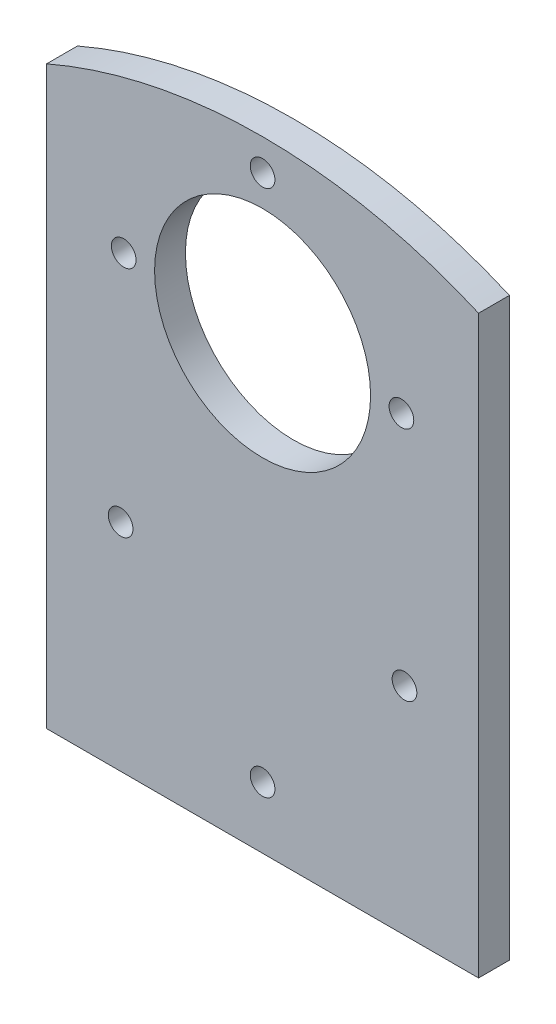
ISO-10303-21;
HEADER;
FILE_DESCRIPTION(('STEP AP214'),'2;1');
FILE_NAME('part.step','',(''),(''),'','','');
FILE_SCHEMA(('AUTOMOTIVE_DESIGN { 1 0 10303 214 1 1 1 1 }'));
ENDSEC;
DATA;
#1=APPLICATION_CONTEXT('core data for automotive mechanical design processes');
#2=APPLICATION_PROTOCOL_DEFINITION('international standard','automotive_design',2000,#1);
#3=PRODUCT_CONTEXT('',#1,'mechanical');
#4=PRODUCT('Part','Part','',(#3));
#5=PRODUCT_RELATED_PRODUCT_CATEGORY('part','',(#4));
#6=PRODUCT_DEFINITION_FORMATION('','',#4);
#7=PRODUCT_DEFINITION_CONTEXT('part definition',#1,'design');
#8=PRODUCT_DEFINITION('design','',#6,#7);
#9=PRODUCT_DEFINITION_SHAPE('','',#8);
#10=(LENGTH_UNIT() NAMED_UNIT(*) SI_UNIT(.MILLI.,.METRE.));
#11=(NAMED_UNIT(*) PLANE_ANGLE_UNIT() SI_UNIT($,.RADIAN.));
#12=(NAMED_UNIT(*) SI_UNIT($,.STERADIAN.) SOLID_ANGLE_UNIT());
#13=UNCERTAINTY_MEASURE_WITH_UNIT(LENGTH_MEASURE(1.E-05),#10,'distance_accuracy_value','');
#14=(GEOMETRIC_REPRESENTATION_CONTEXT(3) GLOBAL_UNCERTAINTY_ASSIGNED_CONTEXT((#13)) GLOBAL_UNIT_ASSIGNED_CONTEXT((#10,
#11,#12)) REPRESENTATION_CONTEXT('',''));
#15=CARTESIAN_POINT('',(0.,0.,0.));
#16=DIRECTION('',(0.,0.,1.));
#17=DIRECTION('',(1.,0.,0.));
#18=AXIS2_PLACEMENT_3D('',#15,#16,#17);
#19=CARTESIAN_POINT('',(-35.,-52.5,5.));
#20=DIRECTION('',(1.,0.,0.));
#21=DIRECTION('',(0.,0.,-1.));
#22=AXIS2_PLACEMENT_3D('',#19,#20,#21);
#23=PLANE('',#22);
#24=DIRECTION('',(0.,-1.,0.));
#25=VECTOR('',#24,1.);
#26=CARTESIAN_POINT('',(-35.,-52.5,5.));
#27=LINE('',#26,#25);
#28=CARTESIAN_POINT('',(-35.,40.7935435021813,5.));
#29=VERTEX_POINT('',#28);
#30=CARTESIAN_POINT('',(-35.,-52.5,5.));
#31=VERTEX_POINT('',#30);
#32=EDGE_CURVE('E88',#29,#31,#27,.T.);
#33=ORIENTED_EDGE('',*,*,#32,.F.);
#34=DIRECTION('',(0.,0.,1.));
#35=VECTOR('',#34,1.);
#36=CARTESIAN_POINT('',(-35.,40.7935435021813,-5.));
#37=LINE('',#36,#35);
#38=CARTESIAN_POINT('',(-35.,40.7935435021813,0.));
#39=VERTEX_POINT('',#38);
#40=EDGE_CURVE('E124',#39,#29,#37,.T.);
#41=ORIENTED_EDGE('',*,*,#40,.F.);
#42=DIRECTION('',(0.,-1.,0.));
#43=VECTOR('',#42,1.);
#44=CARTESIAN_POINT('',(-35.,-52.5,0.));
#45=LINE('',#44,#43);
#46=CARTESIAN_POINT('',(-35.,-52.5,0.));
#47=VERTEX_POINT('',#46);
#48=EDGE_CURVE('E80',#39,#47,#45,.T.);
#49=ORIENTED_EDGE('',*,*,#48,.T.);
#50=DIRECTION('',(0.,0.,-1.));
#51=VECTOR('',#50,1.);
#52=CARTESIAN_POINT('',(-35.,-52.5,5.));
#53=LINE('',#52,#51);
#54=EDGE_CURVE('E42',#31,#47,#53,.T.);
#55=ORIENTED_EDGE('',*,*,#54,.F.);
#56=EDGE_LOOP('',(#33,#41,#49,#55));
#57=FACE_BOUND('',#56,.T.);
#58=ADVANCED_FACE('F35',(#57),#23,.F.);
#59=CARTESIAN_POINT('',(35.,-52.5,5.));
#60=DIRECTION('',(0.,1.,0.));
#61=DIRECTION('',(-1.,0.,0.));
#62=AXIS2_PLACEMENT_3D('',#59,#60,#61);
#63=PLANE('',#62);
#64=DIRECTION('',(1.,0.,0.));
#65=VECTOR('',#64,1.);
#66=CARTESIAN_POINT('',(35.,-52.5,0.));
#67=LINE('',#66,#65);
#68=CARTESIAN_POINT('',(35.,-52.5,0.));
#69=VERTEX_POINT('',#68);
#70=EDGE_CURVE('E70',#47,#69,#67,.T.);
#71=ORIENTED_EDGE('',*,*,#70,.T.);
#72=DIRECTION('',(0.,0.,-1.));
#73=VECTOR('',#72,1.);
#74=CARTESIAN_POINT('',(35.,-52.5,5.));
#75=LINE('',#74,#73);
#76=CARTESIAN_POINT('',(35.,-52.5,5.));
#77=VERTEX_POINT('',#76);
#78=EDGE_CURVE('E73',#77,#69,#75,.T.);
#79=ORIENTED_EDGE('',*,*,#78,.F.);
#80=DIRECTION('',(1.,0.,0.));
#81=VECTOR('',#80,1.);
#82=CARTESIAN_POINT('',(35.,-52.5,5.));
#83=LINE('',#82,#81);
#84=EDGE_CURVE('E57',#31,#77,#83,.T.);
#85=ORIENTED_EDGE('',*,*,#84,.F.);
#86=ORIENTED_EDGE('',*,*,#54,.T.);
#87=EDGE_LOOP('',(#71,#79,#85,#86));
#88=FACE_BOUND('',#87,.T.);
#89=ADVANCED_FACE('F72',(#88),#63,.F.);
#90=CARTESIAN_POINT('',(35.,-52.5,5.));
#91=DIRECTION('',(-1.,0.,0.));
#92=DIRECTION('',(0.,0.,1.));
#93=AXIS2_PLACEMENT_3D('',#90,#91,#92);
#94=PLANE('',#93);
#95=DIRECTION('',(0.,1.,0.));
#96=VECTOR('',#95,1.);
#97=CARTESIAN_POINT('',(35.,-52.5,0.));
#98=LINE('',#97,#96);
#99=CARTESIAN_POINT('',(35.,40.7935435021813,0.));
#100=VERTEX_POINT('',#99);
#101=EDGE_CURVE('E79',#69,#100,#98,.T.);
#102=ORIENTED_EDGE('',*,*,#101,.T.);
#103=DIRECTION('',(0.,0.,1.));
#104=VECTOR('',#103,1.);
#105=CARTESIAN_POINT('',(35.,40.7935435021813,-5.));
#106=LINE('',#105,#104);
#107=CARTESIAN_POINT('',(35.,40.7935435021813,5.));
#108=VERTEX_POINT('',#107);
#109=EDGE_CURVE('E49',#100,#108,#106,.T.);
#110=ORIENTED_EDGE('',*,*,#109,.T.);
#111=DIRECTION('',(0.,1.,0.));
#112=VECTOR('',#111,1.);
#113=CARTESIAN_POINT('',(35.,-52.5,5.));
#114=LINE('',#113,#112);
#115=EDGE_CURVE('E85',#77,#108,#114,.T.);
#116=ORIENTED_EDGE('',*,*,#115,.F.);
#117=ORIENTED_EDGE('',*,*,#78,.T.);
#118=EDGE_LOOP('',(#102,#110,#116,#117));
#119=FACE_BOUND('',#118,.T.);
#120=ADVANCED_FACE('F84',(#119),#94,.F.);
#121=CARTESIAN_POINT('',(0.,0.,5.));
#122=DIRECTION('',(0.,0.,1.));
#123=DIRECTION('',(1.,0.,0.));
#124=AXIS2_PLACEMENT_3D('',#121,#122,#123);
#125=PLANE('',#124);
#126=CARTESIAN_POINT('',(0.,-39.6661412899121,5.));
#127=DIRECTION('',(0.,0.,-1.));
#128=DIRECTION('',(-1.,0.,0.));
#129=AXIS2_PLACEMENT_3D('',#126,#127,#128);
#130=CIRCLE('',#129,87.7425830303795);
#131=EDGE_CURVE('E139',#29,#108,#130,.T.);
#132=ORIENTED_EDGE('',*,*,#131,.F.);
#133=ORIENTED_EDGE('',*,*,#32,.T.);
#134=ORIENTED_EDGE('',*,*,#84,.T.);
#135=ORIENTED_EDGE('',*,*,#115,.T.);
#136=EDGE_LOOP('',(#132,#133,#134,#135));
#137=FACE_BOUND('',#136,.T.);
#138=CARTESIAN_POINT('',(0.,-42.5,5.));
#139=DIRECTION('',(0.,0.,1.));
#140=DIRECTION('',(1.,0.,0.));
#141=AXIS2_PLACEMENT_3D('',#138,#139,#140);
#142=CIRCLE('',#141,2.);
#143=CARTESIAN_POINT('',(2.00000000000002,-42.5,5.));
#144=VERTEX_POINT('',#143);
#145=EDGE_CURVE('E133',#144,#144,#142,.T.);
#146=ORIENTED_EDGE('',*,*,#145,.F.);
#147=EDGE_LOOP('',(#146));
#148=FACE_BOUND('',#147,.T.);
#149=CARTESIAN_POINT('',(-23.,-17.5,5.));
#150=DIRECTION('',(0.,0.,1.));
#151=DIRECTION('',(1.,0.,0.));
#152=AXIS2_PLACEMENT_3D('',#149,#150,#151);
#153=CIRCLE('',#152,2.00000000000001);
#154=CARTESIAN_POINT('',(-21.,-17.5,5.));
#155=VERTEX_POINT('',#154);
#156=EDGE_CURVE('E127',#155,#155,#153,.T.);
#157=ORIENTED_EDGE('',*,*,#156,.F.);
#158=EDGE_LOOP('',(#157));
#159=FACE_BOUND('',#158,.T.);
#160=CARTESIAN_POINT('',(23.,-17.5,5.));
#161=DIRECTION('',(0.,0.,1.));
#162=DIRECTION('',(-1.,0.,0.));
#163=AXIS2_PLACEMENT_3D('',#160,#161,#162);
#164=CIRCLE('',#163,2.00000000000001);
#165=CARTESIAN_POINT('',(21.,-17.5,5.));
#166=VERTEX_POINT('',#165);
#167=EDGE_CURVE('E120',#166,#166,#164,.T.);
#168=ORIENTED_EDGE('',*,*,#167,.F.);
#169=EDGE_LOOP('',(#168));
#170=FACE_BOUND('',#169,.T.);
#171=CARTESIAN_POINT('',(0.,43.,5.));
#172=DIRECTION('',(0.,0.,1.));
#173=DIRECTION('',(1.,0.,0.));
#174=AXIS2_PLACEMENT_3D('',#171,#172,#173);
#175=CIRCLE('',#174,2.);
#176=CARTESIAN_POINT('',(2.,43.,5.));
#177=VERTEX_POINT('',#176);
#178=EDGE_CURVE('E115',#177,#177,#175,.T.);
#179=ORIENTED_EDGE('',*,*,#178,.F.);
#180=EDGE_LOOP('',(#179));
#181=FACE_BOUND('',#180,.T.);
#182=CARTESIAN_POINT('',(-22.5,20.5,5.));
#183=DIRECTION('',(0.,0.,1.));
#184=DIRECTION('',(1.,0.,0.));
#185=AXIS2_PLACEMENT_3D('',#182,#183,#184);
#186=CIRCLE('',#185,2.);
#187=CARTESIAN_POINT('',(-20.5,20.5,5.));
#188=VERTEX_POINT('',#187);
#189=EDGE_CURVE('E112',#188,#188,#186,.T.);
#190=ORIENTED_EDGE('',*,*,#189,.F.);
#191=EDGE_LOOP('',(#190));
#192=FACE_BOUND('',#191,.T.);
#193=CARTESIAN_POINT('',(22.5,20.5,5.));
#194=DIRECTION('',(0.,0.,1.));
#195=DIRECTION('',(1.,0.,0.));
#196=AXIS2_PLACEMENT_3D('',#193,#194,#195);
#197=CIRCLE('',#196,2.);
#198=CARTESIAN_POINT('',(24.5,20.5,5.));
#199=VERTEX_POINT('',#198);
#200=EDGE_CURVE('E105',#199,#199,#197,.T.);
#201=ORIENTED_EDGE('',*,*,#200,.F.);
#202=EDGE_LOOP('',(#201));
#203=FACE_BOUND('',#202,.T.);
#204=CARTESIAN_POINT('',(0.,20.5,5.));
#205=DIRECTION('',(0.,0.,-1.));
#206=DIRECTION('',(-1.,0.,0.));
#207=AXIS2_PLACEMENT_3D('',#204,#205,#206);
#208=CIRCLE('',#207,17.5);
#209=CARTESIAN_POINT('',(-17.5,20.5,5.));
#210=VERTEX_POINT('',#209);
#211=EDGE_CURVE('E93',#210,#210,#208,.T.);
#212=ORIENTED_EDGE('',*,*,#211,.T.);
#213=EDGE_LOOP('',(#212));
#214=FACE_BOUND('',#213,.T.);
#215=ADVANCED_FACE('F149',(#137,#148,#159,#170,#181,#192,#203,#214),#125,.T.);
#216=CARTESIAN_POINT('',(0.,0.,0.));
#217=DIRECTION('',(0.,0.,1.));
#218=DIRECTION('',(1.,0.,0.));
#219=AXIS2_PLACEMENT_3D('',#216,#217,#218);
#220=PLANE('',#219);
#221=CARTESIAN_POINT('',(0.,-42.5,0.));
#222=DIRECTION('',(0.,0.,1.));
#223=DIRECTION('',(1.,0.,0.));
#224=AXIS2_PLACEMENT_3D('',#221,#222,#223);
#225=CIRCLE('',#224,2.);
#226=CARTESIAN_POINT('',(2.00000000000002,-42.5,0.));
#227=VERTEX_POINT('',#226);
#228=EDGE_CURVE('E106',#227,#227,#225,.T.);
#229=ORIENTED_EDGE('',*,*,#228,.T.);
#230=EDGE_LOOP('',(#229));
#231=FACE_BOUND('',#230,.T.);
#232=CARTESIAN_POINT('',(-23.,-17.5,0.));
#233=DIRECTION('',(0.,0.,1.));
#234=DIRECTION('',(1.,0.,0.));
#235=AXIS2_PLACEMENT_3D('',#232,#233,#234);
#236=CIRCLE('',#235,2.00000000000001);
#237=CARTESIAN_POINT('',(-21.,-17.5,0.));
#238=VERTEX_POINT('',#237);
#239=EDGE_CURVE('E130',#238,#238,#236,.T.);
#240=ORIENTED_EDGE('',*,*,#239,.T.);
#241=EDGE_LOOP('',(#240));
#242=FACE_BOUND('',#241,.T.);
#243=CARTESIAN_POINT('',(23.,-17.5,0.));
#244=DIRECTION('',(0.,0.,1.));
#245=DIRECTION('',(-1.,0.,0.));
#246=AXIS2_PLACEMENT_3D('',#243,#244,#245);
#247=CIRCLE('',#246,2.00000000000001);
#248=CARTESIAN_POINT('',(21.,-17.5,0.));
#249=VERTEX_POINT('',#248);
#250=EDGE_CURVE('E123',#249,#249,#247,.T.);
#251=ORIENTED_EDGE('',*,*,#250,.T.);
#252=EDGE_LOOP('',(#251));
#253=FACE_BOUND('',#252,.T.);
#254=CARTESIAN_POINT('',(0.,43.,0.));
#255=DIRECTION('',(0.,0.,1.));
#256=DIRECTION('',(1.,0.,0.));
#257=AXIS2_PLACEMENT_3D('',#254,#255,#256);
#258=CIRCLE('',#257,2.);
#259=CARTESIAN_POINT('',(2.,43.,0.));
#260=VERTEX_POINT('',#259);
#261=EDGE_CURVE('E99',#260,#260,#258,.T.);
#262=ORIENTED_EDGE('',*,*,#261,.T.);
#263=EDGE_LOOP('',(#262));
#264=FACE_BOUND('',#263,.T.);
#265=CARTESIAN_POINT('',(-22.5,20.5,0.));
#266=DIRECTION('',(0.,0.,1.));
#267=DIRECTION('',(1.,0.,0.));
#268=AXIS2_PLACEMENT_3D('',#265,#266,#267);
#269=CIRCLE('',#268,2.);
#270=CARTESIAN_POINT('',(-20.5,20.5,0.));
#271=VERTEX_POINT('',#270);
#272=EDGE_CURVE('E109',#271,#271,#269,.T.);
#273=ORIENTED_EDGE('',*,*,#272,.T.);
#274=EDGE_LOOP('',(#273));
#275=FACE_BOUND('',#274,.T.);
#276=CARTESIAN_POINT('',(22.5,20.5,0.));
#277=DIRECTION('',(0.,0.,1.));
#278=DIRECTION('',(1.,0.,0.));
#279=AXIS2_PLACEMENT_3D('',#276,#277,#278);
#280=CIRCLE('',#279,2.);
#281=CARTESIAN_POINT('',(24.5,20.5,0.));
#282=VERTEX_POINT('',#281);
#283=EDGE_CURVE('E102',#282,#282,#280,.T.);
#284=ORIENTED_EDGE('',*,*,#283,.T.);
#285=EDGE_LOOP('',(#284));
#286=FACE_BOUND('',#285,.T.);
#287=CARTESIAN_POINT('',(0.,20.5,0.));
#288=DIRECTION('',(0.,0.,-1.));
#289=DIRECTION('',(-1.,0.,0.));
#290=AXIS2_PLACEMENT_3D('',#287,#288,#289);
#291=CIRCLE('',#290,17.5);
#292=CARTESIAN_POINT('',(-17.5,20.5,0.));
#293=VERTEX_POINT('',#292);
#294=EDGE_CURVE('E96',#293,#293,#291,.T.);
#295=ORIENTED_EDGE('',*,*,#294,.F.);
#296=EDGE_LOOP('',(#295));
#297=FACE_BOUND('',#296,.T.);
#298=ORIENTED_EDGE('',*,*,#48,.F.);
#299=CARTESIAN_POINT('',(0.,-39.6661412899121,0.));
#300=DIRECTION('',(0.,0.,1.));
#301=DIRECTION('',(1.,0.,0.));
#302=AXIS2_PLACEMENT_3D('',#299,#300,#301);
#303=CIRCLE('',#302,87.7425830303795);
#304=EDGE_CURVE('E11',#39,#100,#303,.F.);
#305=ORIENTED_EDGE('',*,*,#304,.T.);
#306=ORIENTED_EDGE('',*,*,#101,.F.);
#307=ORIENTED_EDGE('',*,*,#70,.F.);
#308=EDGE_LOOP('',(#298,#305,#306,#307));
#309=FACE_BOUND('',#308,.T.);
#310=ADVANCED_FACE('F87',(#231,#242,#253,#264,#275,#286,#297,#309),#220,.F.);
#311=CARTESIAN_POINT('',(0.,20.5,5.));
#312=DIRECTION('',(0.,0.,-1.));
#313=DIRECTION('',(-1.,0.,0.));
#314=AXIS2_PLACEMENT_3D('',#311,#312,#313);
#315=CYLINDRICAL_SURFACE('',#314,17.5);
#316=ORIENTED_EDGE('',*,*,#211,.F.);
#317=EDGE_LOOP('',(#316));
#318=FACE_BOUND('',#317,.T.);
#319=ORIENTED_EDGE('',*,*,#294,.T.);
#320=EDGE_LOOP('',(#319));
#321=FACE_BOUND('',#320,.T.);
#322=ADVANCED_FACE('F167',(#318,#321),#315,.F.);
#323=CARTESIAN_POINT('',(22.5,20.5,0.));
#324=DIRECTION('',(0.,0.,1.));
#325=DIRECTION('',(1.,0.,0.));
#326=AXIS2_PLACEMENT_3D('',#323,#324,#325);
#327=CYLINDRICAL_SURFACE('',#326,2.);
#328=ORIENTED_EDGE('',*,*,#283,.F.);
#329=EDGE_LOOP('',(#328));
#330=FACE_BOUND('',#329,.T.);
#331=ORIENTED_EDGE('',*,*,#200,.T.);
#332=EDGE_LOOP('',(#331));
#333=FACE_BOUND('',#332,.T.);
#334=ADVANCED_FACE('F170',(#330,#333),#327,.F.);
#335=CARTESIAN_POINT('',(-22.5,20.5,0.));
#336=DIRECTION('',(0.,0.,1.));
#337=DIRECTION('',(1.,0.,0.));
#338=AXIS2_PLACEMENT_3D('',#335,#336,#337);
#339=CYLINDRICAL_SURFACE('',#338,2.);
#340=ORIENTED_EDGE('',*,*,#272,.F.);
#341=EDGE_LOOP('',(#340));
#342=FACE_BOUND('',#341,.T.);
#343=ORIENTED_EDGE('',*,*,#189,.T.);
#344=EDGE_LOOP('',(#343));
#345=FACE_BOUND('',#344,.T.);
#346=ADVANCED_FACE('F242',(#342,#345),#339,.F.);
#347=CARTESIAN_POINT('',(0.,43.,0.));
#348=DIRECTION('',(0.,0.,1.));
#349=DIRECTION('',(1.,0.,0.));
#350=AXIS2_PLACEMENT_3D('',#347,#348,#349);
#351=CYLINDRICAL_SURFACE('',#350,2.);
#352=ORIENTED_EDGE('',*,*,#261,.F.);
#353=EDGE_LOOP('',(#352));
#354=FACE_BOUND('',#353,.T.);
#355=ORIENTED_EDGE('',*,*,#178,.T.);
#356=EDGE_LOOP('',(#355));
#357=FACE_BOUND('',#356,.T.);
#358=ADVANCED_FACE('F234',(#354,#357),#351,.F.);
#359=CARTESIAN_POINT('',(23.,-17.5,0.));
#360=DIRECTION('',(0.,0.,1.));
#361=DIRECTION('',(1.,0.,0.));
#362=AXIS2_PLACEMENT_3D('',#359,#360,#361);
#363=CYLINDRICAL_SURFACE('',#362,2.00000000000001);
#364=ORIENTED_EDGE('',*,*,#250,.F.);
#365=EDGE_LOOP('',(#364));
#366=FACE_BOUND('',#365,.T.);
#367=ORIENTED_EDGE('',*,*,#167,.T.);
#368=EDGE_LOOP('',(#367));
#369=FACE_BOUND('',#368,.T.);
#370=ADVANCED_FACE('F226',(#366,#369),#363,.F.);
#371=CARTESIAN_POINT('',(-23.,-17.5,0.));
#372=DIRECTION('',(0.,0.,1.));
#373=DIRECTION('',(1.,0.,0.));
#374=AXIS2_PLACEMENT_3D('',#371,#372,#373);
#375=CYLINDRICAL_SURFACE('',#374,2.00000000000001);
#376=ORIENTED_EDGE('',*,*,#239,.F.);
#377=EDGE_LOOP('',(#376));
#378=FACE_BOUND('',#377,.T.);
#379=ORIENTED_EDGE('',*,*,#156,.T.);
#380=EDGE_LOOP('',(#379));
#381=FACE_BOUND('',#380,.T.);
#382=ADVANCED_FACE('F219',(#378,#381),#375,.F.);
#383=CARTESIAN_POINT('',(0.,-42.5,0.));
#384=DIRECTION('',(0.,0.,1.));
#385=DIRECTION('',(1.,0.,0.));
#386=AXIS2_PLACEMENT_3D('',#383,#384,#385);
#387=CYLINDRICAL_SURFACE('',#386,2.);
#388=ORIENTED_EDGE('',*,*,#228,.F.);
#389=EDGE_LOOP('',(#388));
#390=FACE_BOUND('',#389,.T.);
#391=ORIENTED_EDGE('',*,*,#145,.T.);
#392=EDGE_LOOP('',(#391));
#393=FACE_BOUND('',#392,.T.);
#394=ADVANCED_FACE('F209',(#390,#393),#387,.F.);
#395=CARTESIAN_POINT('',(0.,-39.6661412899121,-5.));
#396=DIRECTION('',(0.,0.,1.));
#397=DIRECTION('',(1.,0.,0.));
#398=AXIS2_PLACEMENT_3D('',#395,#396,#397);
#399=CYLINDRICAL_SURFACE('',#398,87.7425830303795);
#400=ORIENTED_EDGE('',*,*,#40,.T.);
#401=ORIENTED_EDGE('',*,*,#131,.T.);
#402=ORIENTED_EDGE('',*,*,#109,.F.);
#403=ORIENTED_EDGE('',*,*,#304,.F.);
#404=EDGE_LOOP('',(#400,#401,#402,#403));
#405=FACE_BOUND('',#404,.T.);
#406=ADVANCED_FACE('F144',(#405),#399,.T.);
#407=CLOSED_SHELL('',(#58,#89,#120,#215,#310,#322,#334,#346,#358,#370,#382,#394,#406));
#408=MANIFOLD_SOLID_BREP('B2',#407);
#409=ADVANCED_BREP_SHAPE_REPRESENTATION('',(#18,#408),#14);
#410=SHAPE_DEFINITION_REPRESENTATION(#9,#409);
ENDSEC;
END-ISO-10303-21;
